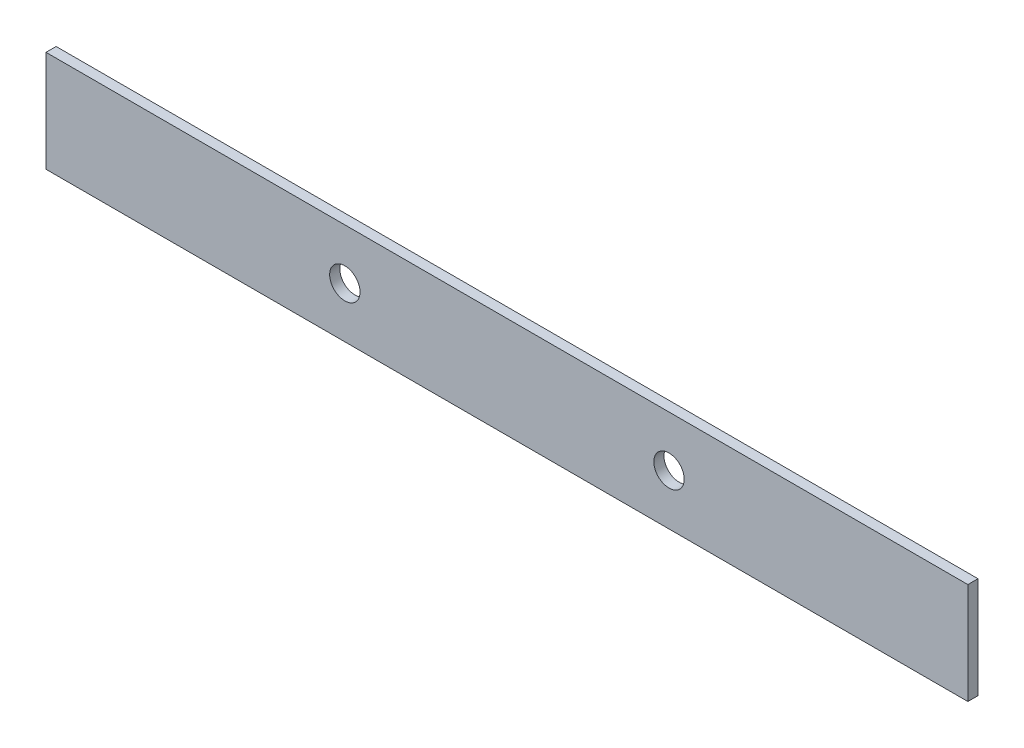
ISO-10303-21;
HEADER;
FILE_DESCRIPTION(('STEP AP214'),'2;1');
FILE_NAME('part.step','',(''),(''),'','','');
FILE_SCHEMA(('AUTOMOTIVE_DESIGN { 1 0 10303 214 1 1 1 1 }'));
ENDSEC;
DATA;
#1=APPLICATION_CONTEXT('core data for automotive mechanical design processes');
#2=APPLICATION_PROTOCOL_DEFINITION('international standard','automotive_design',2000,#1);
#3=PRODUCT_CONTEXT('',#1,'mechanical');
#4=PRODUCT('Part','Part','',(#3));
#5=PRODUCT_RELATED_PRODUCT_CATEGORY('part','',(#4));
#6=PRODUCT_DEFINITION_FORMATION('','',#4);
#7=PRODUCT_DEFINITION_CONTEXT('part definition',#1,'design');
#8=PRODUCT_DEFINITION('design','',#6,#7);
#9=PRODUCT_DEFINITION_SHAPE('','',#8);
#10=(LENGTH_UNIT() NAMED_UNIT(*) SI_UNIT(.MILLI.,.METRE.));
#11=(NAMED_UNIT(*) PLANE_ANGLE_UNIT() SI_UNIT($,.RADIAN.));
#12=(NAMED_UNIT(*) SI_UNIT($,.STERADIAN.) SOLID_ANGLE_UNIT());
#13=UNCERTAINTY_MEASURE_WITH_UNIT(LENGTH_MEASURE(1.E-05),#10,'distance_accuracy_value','');
#14=(GEOMETRIC_REPRESENTATION_CONTEXT(3) GLOBAL_UNCERTAINTY_ASSIGNED_CONTEXT((#13)) GLOBAL_UNIT_ASSIGNED_CONTEXT((#10,
#11,#12)) REPRESENTATION_CONTEXT('',''));
#15=CARTESIAN_POINT('',(0.,0.,0.));
#16=DIRECTION('',(0.,0.,1.));
#17=DIRECTION('',(1.,0.,0.));
#18=AXIS2_PLACEMENT_3D('',#15,#16,#17);
#19=CARTESIAN_POINT('',(0.,0.,10.));
#20=DIRECTION('',(0.,0.,-1.));
#21=DIRECTION('',(-1.,0.,0.));
#22=AXIS2_PLACEMENT_3D('',#19,#20,#21);
#23=PLANE('',#22);
#24=CARTESIAN_POINT('',(295.,50.,10.));
#25=DIRECTION('',(0.,0.,1.));
#26=DIRECTION('',(1.,0.,0.));
#27=AXIS2_PLACEMENT_3D('',#24,#25,#26);
#28=CIRCLE('',#27,15.);
#29=CARTESIAN_POINT('',(310.,50.,10.));
#30=VERTEX_POINT('',#29);
#31=EDGE_CURVE('E100',#30,#30,#28,.T.);
#32=ORIENTED_EDGE('',*,*,#31,.F.);
#33=EDGE_LOOP('',(#32));
#34=FACE_BOUND('',#33,.T.);
#35=DIRECTION('',(0.,-1.,0.));
#36=VECTOR('',#35,1.);
#37=CARTESIAN_POINT('',(0.,0.,10.));
#38=LINE('',#37,#36);
#39=CARTESIAN_POINT('',(0.,100.,10.));
#40=VERTEX_POINT('',#39);
#41=CARTESIAN_POINT('',(0.,0.,10.));
#42=VERTEX_POINT('',#41);
#43=EDGE_CURVE('E85',#40,#42,#38,.T.);
#44=ORIENTED_EDGE('',*,*,#43,.T.);
#45=DIRECTION('',(1.,0.,0.));
#46=VECTOR('',#45,1.);
#47=CARTESIAN_POINT('',(0.,0.,10.));
#48=LINE('',#47,#46);
#49=CARTESIAN_POINT('',(910.,0.,10.));
#50=VERTEX_POINT('',#49);
#51=EDGE_CURVE('E80',#42,#50,#48,.T.);
#52=ORIENTED_EDGE('',*,*,#51,.T.);
#53=DIRECTION('',(0.,1.,0.));
#54=VECTOR('',#53,1.);
#55=CARTESIAN_POINT('',(910.,0.,10.));
#56=LINE('',#55,#54);
#57=CARTESIAN_POINT('',(910.,100.,10.));
#58=VERTEX_POINT('',#57);
#59=EDGE_CURVE('E83',#50,#58,#56,.T.);
#60=ORIENTED_EDGE('',*,*,#59,.T.);
#61=DIRECTION('',(-1.,0.,0.));
#62=VECTOR('',#61,1.);
#63=CARTESIAN_POINT('',(0.,100.,10.));
#64=LINE('',#63,#62);
#65=EDGE_CURVE('E50',#58,#40,#64,.T.);
#66=ORIENTED_EDGE('',*,*,#65,.T.);
#67=EDGE_LOOP('',(#44,#52,#60,#66));
#68=FACE_BOUND('',#67,.T.);
#69=CARTESIAN_POINT('',(615.,50.,10.));
#70=DIRECTION('',(0.,0.,1.));
#71=DIRECTION('',(-1.,0.,0.));
#72=AXIS2_PLACEMENT_3D('',#69,#70,#71);
#73=CIRCLE('',#72,15.);
#74=CARTESIAN_POINT('',(600.,50.,10.));
#75=VERTEX_POINT('',#74);
#76=EDGE_CURVE('E115',#75,#75,#73,.T.);
#77=ORIENTED_EDGE('',*,*,#76,.F.);
#78=EDGE_LOOP('',(#77));
#79=FACE_BOUND('',#78,.T.);
#80=ADVANCED_FACE('F33',(#34,#68,#79),#23,.F.);
#81=CARTESIAN_POINT('',(0.,0.,0.));
#82=DIRECTION('',(0.,0.,-1.));
#83=DIRECTION('',(-1.,0.,0.));
#84=AXIS2_PLACEMENT_3D('',#81,#82,#83);
#85=PLANE('',#84);
#86=CARTESIAN_POINT('',(295.,50.,0.));
#87=DIRECTION('',(0.,0.,1.));
#88=DIRECTION('',(1.,0.,0.));
#89=AXIS2_PLACEMENT_3D('',#86,#87,#88);
#90=CIRCLE('',#89,15.);
#91=CARTESIAN_POINT('',(310.,50.,0.));
#92=VERTEX_POINT('',#91);
#93=EDGE_CURVE('E112',#92,#92,#90,.T.);
#94=ORIENTED_EDGE('',*,*,#93,.T.);
#95=EDGE_LOOP('',(#94));
#96=FACE_BOUND('',#95,.T.);
#97=DIRECTION('',(0.,-1.,0.));
#98=VECTOR('',#97,1.);
#99=CARTESIAN_POINT('',(0.,0.,0.));
#100=LINE('',#99,#98);
#101=CARTESIAN_POINT('',(0.,100.,0.));
#102=VERTEX_POINT('',#101);
#103=CARTESIAN_POINT('',(0.,0.,0.));
#104=VERTEX_POINT('',#103);
#105=EDGE_CURVE('E97',#102,#104,#100,.T.);
#106=ORIENTED_EDGE('',*,*,#105,.F.);
#107=DIRECTION('',(-1.,0.,0.));
#108=VECTOR('',#107,1.);
#109=CARTESIAN_POINT('',(0.,100.,0.));
#110=LINE('',#109,#108);
#111=CARTESIAN_POINT('',(910.,100.,0.));
#112=VERTEX_POINT('',#111);
#113=EDGE_CURVE('E73',#112,#102,#110,.T.);
#114=ORIENTED_EDGE('',*,*,#113,.F.);
#115=DIRECTION('',(0.,1.,0.));
#116=VECTOR('',#115,1.);
#117=CARTESIAN_POINT('',(910.,0.,0.));
#118=LINE('',#117,#116);
#119=CARTESIAN_POINT('',(910.,0.,0.));
#120=VERTEX_POINT('',#119);
#121=EDGE_CURVE('E67',#120,#112,#118,.T.);
#122=ORIENTED_EDGE('',*,*,#121,.F.);
#123=DIRECTION('',(1.,0.,0.));
#124=VECTOR('',#123,1.);
#125=CARTESIAN_POINT('',(0.,0.,0.));
#126=LINE('',#125,#124);
#127=EDGE_CURVE('E89',#104,#120,#126,.T.);
#128=ORIENTED_EDGE('',*,*,#127,.F.);
#129=EDGE_LOOP('',(#106,#114,#122,#128));
#130=FACE_BOUND('',#129,.T.);
#131=CARTESIAN_POINT('',(615.,50.,0.));
#132=DIRECTION('',(0.,0.,1.));
#133=DIRECTION('',(-1.,0.,0.));
#134=AXIS2_PLACEMENT_3D('',#131,#132,#133);
#135=CIRCLE('',#134,15.);
#136=CARTESIAN_POINT('',(600.,50.,0.));
#137=VERTEX_POINT('',#136);
#138=EDGE_CURVE('E118',#137,#137,#135,.T.);
#139=ORIENTED_EDGE('',*,*,#138,.T.);
#140=EDGE_LOOP('',(#139));
#141=FACE_BOUND('',#140,.T.);
#142=ADVANCED_FACE('F108',(#96,#130,#141),#85,.T.);
#143=CARTESIAN_POINT('',(0.,0.,10.));
#144=DIRECTION('',(1.,0.,0.));
#145=DIRECTION('',(0.,0.,-1.));
#146=AXIS2_PLACEMENT_3D('',#143,#144,#145);
#147=PLANE('',#146);
#148=ORIENTED_EDGE('',*,*,#105,.T.);
#149=DIRECTION('',(0.,0.,-1.));
#150=VECTOR('',#149,1.);
#151=CARTESIAN_POINT('',(0.,0.,10.));
#152=LINE('',#151,#150);
#153=EDGE_CURVE('E11',#42,#104,#152,.T.);
#154=ORIENTED_EDGE('',*,*,#153,.F.);
#155=ORIENTED_EDGE('',*,*,#43,.F.);
#156=DIRECTION('',(0.,0.,-1.));
#157=VECTOR('',#156,1.);
#158=CARTESIAN_POINT('',(0.,100.,10.));
#159=LINE('',#158,#157);
#160=EDGE_CURVE('E93',#40,#102,#159,.T.);
#161=ORIENTED_EDGE('',*,*,#160,.T.);
#162=EDGE_LOOP('',(#148,#154,#155,#161));
#163=FACE_BOUND('',#162,.T.);
#164=ADVANCED_FACE('F35',(#163),#147,.F.);
#165=CARTESIAN_POINT('',(0.,0.,10.));
#166=DIRECTION('',(0.,1.,0.));
#167=DIRECTION('',(0.,0.,1.));
#168=AXIS2_PLACEMENT_3D('',#165,#166,#167);
#169=PLANE('',#168);
#170=ORIENTED_EDGE('',*,*,#127,.T.);
#171=DIRECTION('',(0.,0.,-1.));
#172=VECTOR('',#171,1.);
#173=CARTESIAN_POINT('',(910.,0.,10.));
#174=LINE('',#173,#172);
#175=EDGE_CURVE('E42',#50,#120,#174,.T.);
#176=ORIENTED_EDGE('',*,*,#175,.F.);
#177=ORIENTED_EDGE('',*,*,#51,.F.);
#178=ORIENTED_EDGE('',*,*,#153,.T.);
#179=EDGE_LOOP('',(#170,#176,#177,#178));
#180=FACE_BOUND('',#179,.T.);
#181=ADVANCED_FACE('F88',(#180),#169,.F.);
#182=CARTESIAN_POINT('',(910.,0.,10.));
#183=DIRECTION('',(-1.,0.,0.));
#184=DIRECTION('',(0.,0.,1.));
#185=AXIS2_PLACEMENT_3D('',#182,#183,#184);
#186=PLANE('',#185);
#187=ORIENTED_EDGE('',*,*,#121,.T.);
#188=DIRECTION('',(0.,0.,-1.));
#189=VECTOR('',#188,1.);
#190=CARTESIAN_POINT('',(910.,100.,10.));
#191=LINE('',#190,#189);
#192=EDGE_CURVE('E90',#58,#112,#191,.T.);
#193=ORIENTED_EDGE('',*,*,#192,.F.);
#194=ORIENTED_EDGE('',*,*,#59,.F.);
#195=ORIENTED_EDGE('',*,*,#175,.T.);
#196=EDGE_LOOP('',(#187,#193,#194,#195));
#197=FACE_BOUND('',#196,.T.);
#198=ADVANCED_FACE('F91',(#197),#186,.F.);
#199=CARTESIAN_POINT('',(0.,100.,10.));
#200=DIRECTION('',(0.,-1.,0.));
#201=DIRECTION('',(0.,0.,-1.));
#202=AXIS2_PLACEMENT_3D('',#199,#200,#201);
#203=PLANE('',#202);
#204=ORIENTED_EDGE('',*,*,#113,.T.);
#205=ORIENTED_EDGE('',*,*,#160,.F.);
#206=ORIENTED_EDGE('',*,*,#65,.F.);
#207=ORIENTED_EDGE('',*,*,#192,.T.);
#208=EDGE_LOOP('',(#204,#205,#206,#207));
#209=FACE_BOUND('',#208,.T.);
#210=ADVANCED_FACE('F105',(#209),#203,.F.);
#211=CARTESIAN_POINT('',(295.,50.,10.));
#212=DIRECTION('',(0.,0.,-1.));
#213=DIRECTION('',(-1.,0.,0.));
#214=AXIS2_PLACEMENT_3D('',#211,#212,#213);
#215=CYLINDRICAL_SURFACE('',#214,15.);
#216=ORIENTED_EDGE('',*,*,#31,.T.);
#217=EDGE_LOOP('',(#216));
#218=FACE_BOUND('',#217,.T.);
#219=ORIENTED_EDGE('',*,*,#93,.F.);
#220=EDGE_LOOP('',(#219));
#221=FACE_BOUND('',#220,.T.);
#222=ADVANCED_FACE('F136',(#218,#221),#215,.F.);
#223=CARTESIAN_POINT('',(615.,50.,10.));
#224=DIRECTION('',(0.,0.,-1.));
#225=DIRECTION('',(-1.,0.,0.));
#226=AXIS2_PLACEMENT_3D('',#223,#224,#225);
#227=CYLINDRICAL_SURFACE('',#226,15.);
#228=ORIENTED_EDGE('',*,*,#76,.T.);
#229=EDGE_LOOP('',(#228));
#230=FACE_BOUND('',#229,.T.);
#231=ORIENTED_EDGE('',*,*,#138,.F.);
#232=EDGE_LOOP('',(#231));
#233=FACE_BOUND('',#232,.T.);
#234=ADVANCED_FACE('F124',(#230,#233),#227,.F.);
#235=CLOSED_SHELL('',(#80,#142,#164,#181,#198,#210,#222,#234));
#236=MANIFOLD_SOLID_BREP('B2',#235);
#237=ADVANCED_BREP_SHAPE_REPRESENTATION('',(#18,#236),#14);
#238=SHAPE_DEFINITION_REPRESENTATION(#9,#237);
ENDSEC;
END-ISO-10303-21;
